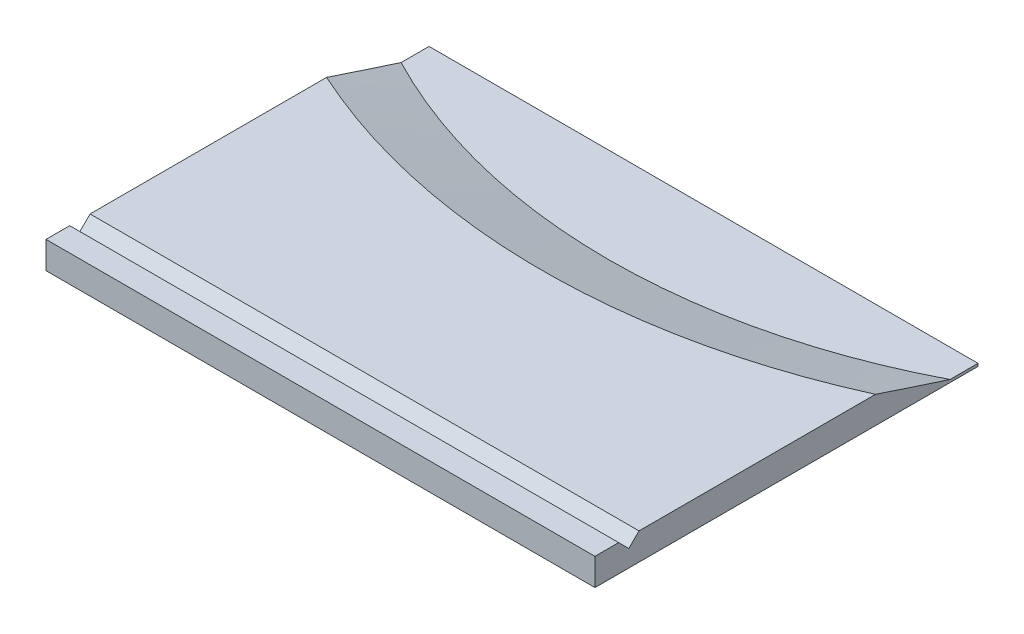
ISO-10303-21;
HEADER;
FILE_DESCRIPTION(('STEP AP214'),'2;1');
FILE_NAME('part.step','',(''),(''),'','','');
FILE_SCHEMA(('AUTOMOTIVE_DESIGN { 1 0 10303 214 1 1 1 1 }'));
ENDSEC;
DATA;
#1=APPLICATION_CONTEXT('core data for automotive mechanical design processes');
#2=APPLICATION_PROTOCOL_DEFINITION('international standard','automotive_design',2000,#1);
#3=PRODUCT_CONTEXT('',#1,'mechanical');
#4=PRODUCT('Part','Part','',(#3));
#5=PRODUCT_RELATED_PRODUCT_CATEGORY('part','',(#4));
#6=PRODUCT_DEFINITION_FORMATION('','',#4);
#7=PRODUCT_DEFINITION_CONTEXT('part definition',#1,'design');
#8=PRODUCT_DEFINITION('design','',#6,#7);
#9=PRODUCT_DEFINITION_SHAPE('','',#8);
#10=(LENGTH_UNIT() NAMED_UNIT(*) SI_UNIT(.MILLI.,.METRE.));
#11=(NAMED_UNIT(*) PLANE_ANGLE_UNIT() SI_UNIT($,.RADIAN.));
#12=(NAMED_UNIT(*) SI_UNIT($,.STERADIAN.) SOLID_ANGLE_UNIT());
#13=UNCERTAINTY_MEASURE_WITH_UNIT(LENGTH_MEASURE(1.E-05),#10,'distance_accuracy_value','');
#14=(GEOMETRIC_REPRESENTATION_CONTEXT(3) GLOBAL_UNCERTAINTY_ASSIGNED_CONTEXT((#13)) GLOBAL_UNIT_ASSIGNED_CONTEXT((#10,
#11,#12)) REPRESENTATION_CONTEXT('',''));
#15=CARTESIAN_POINT('',(0.,0.,0.));
#16=DIRECTION('',(0.,0.,1.));
#17=DIRECTION('',(1.,0.,0.));
#18=AXIS2_PLACEMENT_3D('',#15,#16,#17);
#19=CARTESIAN_POINT('',(0.,2.,0.));
#20=DIRECTION('',(0.,-1.,0.));
#21=DIRECTION('',(0.,0.,-1.));
#22=AXIS2_PLACEMENT_3D('',#19,#20,#21);
#23=PLANE('',#22);
#24=DIRECTION('',(0.,0.,1.));
#25=VECTOR('',#24,1.);
#26=CARTESIAN_POINT('',(-20.25,2.,-14.13));
#27=LINE('',#26,#25);
#28=CARTESIAN_POINT('',(-20.25,2.,-6.56997877610749));
#29=VERTEX_POINT('',#28);
#30=CARTESIAN_POINT('',(-20.25,2.,10.88));
#31=VERTEX_POINT('',#30);
#32=EDGE_CURVE('E169',#29,#31,#27,.T.);
#33=ORIENTED_EDGE('',*,*,#32,.T.);
#34=DIRECTION('',(1.,0.,0.));
#35=VECTOR('',#34,1.);
#36=CARTESIAN_POINT('',(-20.25,2.,10.88));
#37=LINE('',#36,#35);
#38=CARTESIAN_POINT('',(20.25,2.,10.88));
#39=VERTEX_POINT('',#38);
#40=EDGE_CURVE('E130',#31,#39,#37,.T.);
#41=ORIENTED_EDGE('',*,*,#40,.T.);
#42=DIRECTION('',(0.,0.,-1.));
#43=VECTOR('',#42,1.);
#44=CARTESIAN_POINT('',(20.25,2.,-14.13));
#45=LINE('',#44,#43);
#46=CARTESIAN_POINT('',(20.25,2.,-6.56997877610749));
#47=VERTEX_POINT('',#46);
#48=EDGE_CURVE('E175',#39,#47,#45,.T.);
#49=ORIENTED_EDGE('',*,*,#48,.T.);
#50=CARTESIAN_POINT('',(0.,2.,-51.13));
#51=DIRECTION('',(0.,-1.,0.));
#52=DIRECTION('',(0.,0.,-1.));
#53=AXIS2_PLACEMENT_3D('',#50,#51,#52);
#54=CIRCLE('',#53,48.9454593550183);
#55=EDGE_CURVE('E211',#47,#29,#54,.T.);
#56=ORIENTED_EDGE('',*,*,#55,.T.);
#57=EDGE_LOOP('',(#33,#41,#49,#56));
#58=FACE_BOUND('',#57,.T.);
#59=ADVANCED_FACE('F45',(#58),#23,.F.);
#60=CARTESIAN_POINT('',(20.25,2.,-14.13));
#61=DIRECTION('',(0.,0.,1.));
#62=DIRECTION('',(1.,0.,0.));
#63=AXIS2_PLACEMENT_3D('',#60,#61,#62);
#64=PLANE('',#63);
#65=DIRECTION('',(-1.,0.,0.));
#66=VECTOR('',#65,1.);
#67=CARTESIAN_POINT('',(20.25,0.2,-14.13));
#68=LINE('',#67,#66);
#69=CARTESIAN_POINT('',(20.25,0.2,-14.13));
#70=VERTEX_POINT('',#69);
#71=CARTESIAN_POINT('',(-20.25,0.2,-14.13));
#72=VERTEX_POINT('',#71);
#73=EDGE_CURVE('E208',#70,#72,#68,.T.);
#74=ORIENTED_EDGE('',*,*,#73,.F.);
#75=DIRECTION('',(0.,-1.,0.));
#76=VECTOR('',#75,1.);
#77=CARTESIAN_POINT('',(20.25,2.,-14.13));
#78=LINE('',#77,#76);
#79=CARTESIAN_POINT('',(20.25,0.,-14.13));
#80=VERTEX_POINT('',#79);
#81=EDGE_CURVE('E197',#70,#80,#78,.T.);
#82=ORIENTED_EDGE('',*,*,#81,.T.);
#83=DIRECTION('',(-1.,0.,0.));
#84=VECTOR('',#83,1.);
#85=CARTESIAN_POINT('',(20.25,0.,-14.13));
#86=LINE('',#85,#84);
#87=CARTESIAN_POINT('',(-20.25,0.,-14.13));
#88=VERTEX_POINT('',#87);
#89=EDGE_CURVE('E191',#80,#88,#86,.T.);
#90=ORIENTED_EDGE('',*,*,#89,.T.);
#91=DIRECTION('',(0.,-1.,0.));
#92=VECTOR('',#91,1.);
#93=CARTESIAN_POINT('',(-20.25,2.,-14.13));
#94=LINE('',#93,#92);
#95=EDGE_CURVE('E180',#72,#88,#94,.T.);
#96=ORIENTED_EDGE('',*,*,#95,.F.);
#97=EDGE_LOOP('',(#74,#82,#90,#96));
#98=FACE_BOUND('',#97,.T.);
#99=ADVANCED_FACE('F222',(#98),#64,.F.);
#100=CARTESIAN_POINT('',(-20.25,2.,-14.13));
#101=DIRECTION('',(1.,0.,0.));
#102=DIRECTION('',(0.,0.,-1.));
#103=AXIS2_PLACEMENT_3D('',#100,#101,#102);
#104=PLANE('',#103);
#105=DIRECTION('',(0.,-0.707106781186547,-0.707106781186548));
#106=VECTOR('',#105,1.);
#107=CARTESIAN_POINT('',(-20.25,2.,12.38));
#108=LINE('',#107,#106);
#109=CARTESIAN_POINT('',(-20.25,2.,12.38));
#110=VERTEX_POINT('',#109);
#111=CARTESIAN_POINT('',(-20.25,1.25,11.63));
#112=VERTEX_POINT('',#111);
#113=EDGE_CURVE('E68',#110,#112,#108,.T.);
#114=ORIENTED_EDGE('',*,*,#113,.T.);
#115=DIRECTION('',(0.,0.707106781186547,-0.707106781186548));
#116=VECTOR('',#115,1.);
#117=CARTESIAN_POINT('',(-20.25,1.25,11.63));
#118=LINE('',#117,#116);
#119=EDGE_CURVE('E134',#112,#31,#118,.T.);
#120=ORIENTED_EDGE('',*,*,#119,.T.);
#121=ORIENTED_EDGE('',*,*,#32,.F.);
#122=CARTESIAN_POINT('',(-20.25,2.,-6.56997877610749));
#123=CARTESIAN_POINT('',(-20.25,1.84839227835257,-7.02751527477542));
#124=CARTESIAN_POINT('',(-20.25,1.69714261779571,-7.48517053881371));
#125=CARTESIAN_POINT('',(-20.25,1.39542428685237,-8.40073667362824));
#126=CARTESIAN_POINT('',(-20.25,1.24495561378549,-8.85864754352125));
#127=CARTESIAN_POINT('',(-20.25,0.94486300778386,-9.77474633983645));
#128=CARTESIAN_POINT('',(-20.25,0.795239075275908,-10.2329342663985));
#129=CARTESIAN_POINT('',(-20.25,0.496910845473848,-11.1496111241684));
#130=CARTESIAN_POINT('',(-20.25,0.34820655134074,-11.6081000564049));
#131=CARTESIAN_POINT('',(-20.25,0.199999999999995,-12.0667500071999));
#132=B_SPLINE_CURVE_WITH_KNOTS('',3,(#122,#123,#124,#125,#126,#127,#128,#129,#130,#131),
.UNSPECIFIED.,.F.,.F.,(4,2,2,2,4),(0.,1.44600172316287,2.89199848029221,4.33799596794958,
5.78399842305987),.UNSPECIFIED.);
#133=CARTESIAN_POINT('',(-20.25,0.2,-12.0667500071999));
#134=VERTEX_POINT('',#133);
#135=EDGE_CURVE('E61',#29,#134,#132,.T.);
#136=ORIENTED_EDGE('',*,*,#135,.T.);
#137=DIRECTION('',(0.,0.,1.));
#138=VECTOR('',#137,1.);
#139=CARTESIAN_POINT('',(-20.25,0.2,-14.13));
#140=LINE('',#139,#138);
#141=EDGE_CURVE('E164',#72,#134,#140,.T.);
#142=ORIENTED_EDGE('',*,*,#141,.F.);
#143=ORIENTED_EDGE('',*,*,#95,.T.);
#144=DIRECTION('',(0.,0.,1.));
#145=VECTOR('',#144,1.);
#146=CARTESIAN_POINT('',(-20.25,0.,-14.13));
#147=LINE('',#146,#145);
#148=CARTESIAN_POINT('',(-20.25,0.,14.13));
#149=VERTEX_POINT('',#148);
#150=EDGE_CURVE('E168',#88,#149,#147,.T.);
#151=ORIENTED_EDGE('',*,*,#150,.T.);
#152=DIRECTION('',(0.,-1.,0.));
#153=VECTOR('',#152,1.);
#154=CARTESIAN_POINT('',(-20.25,2.,14.13));
#155=LINE('',#154,#153);
#156=CARTESIAN_POINT('',(-20.25,2.,14.13));
#157=VERTEX_POINT('',#156);
#158=EDGE_CURVE('E204',#157,#149,#155,.T.);
#159=ORIENTED_EDGE('',*,*,#158,.F.);
#160=EDGE_CURVE('E145',#110,#157,#27,.T.);
#161=ORIENTED_EDGE('',*,*,#160,.F.);
#162=EDGE_LOOP('',(#114,#120,#121,#136,#142,#143,#151,#159,#161));
#163=FACE_BOUND('',#162,.T.);
#164=ADVANCED_FACE('F143',(#163),#104,.F.);
#165=CARTESIAN_POINT('',(20.25,2.,14.13));
#166=DIRECTION('',(0.,0.,-1.));
#167=DIRECTION('',(-1.,0.,0.));
#168=AXIS2_PLACEMENT_3D('',#165,#166,#167);
#169=PLANE('',#168);
#170=DIRECTION('',(1.,0.,0.));
#171=VECTOR('',#170,1.);
#172=CARTESIAN_POINT('',(20.25,0.,14.13));
#173=LINE('',#172,#171);
#174=CARTESIAN_POINT('',(20.25,0.,14.13));
#175=VERTEX_POINT('',#174);
#176=EDGE_CURVE('E184',#149,#175,#173,.T.);
#177=ORIENTED_EDGE('',*,*,#176,.T.);
#178=DIRECTION('',(0.,-1.,0.));
#179=VECTOR('',#178,1.);
#180=CARTESIAN_POINT('',(20.25,2.,14.13));
#181=LINE('',#180,#179);
#182=CARTESIAN_POINT('',(20.25,2.,14.13));
#183=VERTEX_POINT('',#182);
#184=EDGE_CURVE('E200',#183,#175,#181,.T.);
#185=ORIENTED_EDGE('',*,*,#184,.F.);
#186=DIRECTION('',(1.,0.,0.));
#187=VECTOR('',#186,1.);
#188=CARTESIAN_POINT('',(20.25,2.,14.13));
#189=LINE('',#188,#187);
#190=EDGE_CURVE('E172',#157,#183,#189,.T.);
#191=ORIENTED_EDGE('',*,*,#190,.F.);
#192=ORIENTED_EDGE('',*,*,#158,.T.);
#193=EDGE_LOOP('',(#177,#185,#191,#192));
#194=FACE_BOUND('',#193,.T.);
#195=ADVANCED_FACE('F221',(#194),#169,.F.);
#196=CARTESIAN_POINT('',(20.25,2.,-14.13));
#197=DIRECTION('',(-1.,0.,0.));
#198=DIRECTION('',(0.,0.,1.));
#199=AXIS2_PLACEMENT_3D('',#196,#197,#198);
#200=PLANE('',#199);
#201=ORIENTED_EDGE('',*,*,#48,.F.);
#202=DIRECTION('',(0.,0.707106781186547,-0.707106781186548));
#203=VECTOR('',#202,1.);
#204=CARTESIAN_POINT('',(20.25,1.25,11.63));
#205=LINE('',#204,#203);
#206=CARTESIAN_POINT('',(20.25,1.25,11.63));
#207=VERTEX_POINT('',#206);
#208=EDGE_CURVE('E147',#207,#39,#205,.T.);
#209=ORIENTED_EDGE('',*,*,#208,.F.);
#210=DIRECTION('',(0.,-0.707106781186547,-0.707106781186548));
#211=VECTOR('',#210,1.);
#212=CARTESIAN_POINT('',(20.25,2.,12.38));
#213=LINE('',#212,#211);
#214=CARTESIAN_POINT('',(20.25,2.,12.38));
#215=VERTEX_POINT('',#214);
#216=EDGE_CURVE('E126',#215,#207,#213,.T.);
#217=ORIENTED_EDGE('',*,*,#216,.F.);
#218=EDGE_CURVE('E176',#183,#215,#45,.T.);
#219=ORIENTED_EDGE('',*,*,#218,.F.);
#220=ORIENTED_EDGE('',*,*,#184,.T.);
#221=DIRECTION('',(0.,0.,-1.));
#222=VECTOR('',#221,1.);
#223=CARTESIAN_POINT('',(20.25,0.,-14.13));
#224=LINE('',#223,#222);
#225=EDGE_CURVE('E187',#175,#80,#224,.T.);
#226=ORIENTED_EDGE('',*,*,#225,.T.);
#227=ORIENTED_EDGE('',*,*,#81,.F.);
#228=DIRECTION('',(0.,0.,-1.));
#229=VECTOR('',#228,1.);
#230=CARTESIAN_POINT('',(20.25,0.2,-14.13));
#231=LINE('',#230,#229);
#232=CARTESIAN_POINT('',(20.25,0.2,-12.0667500071999));
#233=VERTEX_POINT('',#232);
#234=EDGE_CURVE('E161',#233,#70,#231,.T.);
#235=ORIENTED_EDGE('',*,*,#234,.F.);
#236=CARTESIAN_POINT('',(20.25,0.199999999999993,-12.0667500071999));
#237=CARTESIAN_POINT('',(20.25,0.348206551340739,-11.6081000564049));
#238=CARTESIAN_POINT('',(20.25,0.496910845473848,-11.1496111241684));
#239=CARTESIAN_POINT('',(20.25,0.795239075275908,-10.2329342663985));
#240=CARTESIAN_POINT('',(20.25,0.94486300778386,-9.77474633983645));
#241=CARTESIAN_POINT('',(20.25,1.24495561378549,-8.85864754352125));
#242=CARTESIAN_POINT('',(20.25,1.39542428685237,-8.40073667362823));
#243=CARTESIAN_POINT('',(20.25,1.69714261779571,-7.4851705388137));
#244=CARTESIAN_POINT('',(20.25,1.84839227835257,-7.02751527477542));
#245=CARTESIAN_POINT('',(20.25,2.,-6.56997877610749));
#246=B_SPLINE_CURVE_WITH_KNOTS('',3,(#236,#237,#238,#239,#240,#241,#242,#243,#244,#245),
.UNSPECIFIED.,.F.,.F.,(4,2,2,2,4),(0.,1.44600245511028,2.89199994276766,4.337996699897,
5.78399842305987),.UNSPECIFIED.);
#247=EDGE_CURVE('E11',#233,#47,#246,.T.);
#248=ORIENTED_EDGE('',*,*,#247,.T.);
#249=EDGE_LOOP('',(#201,#209,#217,#219,#220,#226,#227,#235,#248));
#250=FACE_BOUND('',#249,.T.);
#251=ADVANCED_FACE('F224',(#250),#200,.F.);
#252=ORIENTED_EDGE('',*,*,#218,.T.);
#253=DIRECTION('',(1.,0.,0.));
#254=VECTOR('',#253,1.);
#255=CARTESIAN_POINT('',(-20.25,2.,12.38));
#256=LINE('',#255,#254);
#257=EDGE_CURVE('E131',#110,#215,#256,.T.);
#258=ORIENTED_EDGE('',*,*,#257,.F.);
#259=ORIENTED_EDGE('',*,*,#160,.T.);
#260=ORIENTED_EDGE('',*,*,#190,.T.);
#261=EDGE_LOOP('',(#252,#258,#259,#260));
#262=FACE_BOUND('',#261,.T.);
#263=ADVANCED_FACE('F229',(#262),#23,.F.);
#264=CARTESIAN_POINT('',(0.,0.,0.));
#265=DIRECTION('',(0.,-1.,0.));
#266=DIRECTION('',(0.,0.,-1.));
#267=AXIS2_PLACEMENT_3D('',#264,#265,#266);
#268=PLANE('',#267);
#269=ORIENTED_EDGE('',*,*,#150,.F.);
#270=ORIENTED_EDGE('',*,*,#89,.F.);
#271=ORIENTED_EDGE('',*,*,#225,.F.);
#272=ORIENTED_EDGE('',*,*,#176,.F.);
#273=EDGE_LOOP('',(#269,#270,#271,#272));
#274=FACE_BOUND('',#273,.T.);
#275=ADVANCED_FACE('F234',(#274),#268,.T.);
#276=CARTESIAN_POINT('',(0.,0.2,-51.13));
#277=DIRECTION('',(0.,1.,0.));
#278=DIRECTION('',(0.,0.,1.));
#279=AXIS2_PLACEMENT_3D('',#276,#277,#278);
#280=PLANE('',#279);
#281=ORIENTED_EDGE('',*,*,#141,.T.);
#282=CARTESIAN_POINT('',(0.,0.2,-51.13));
#283=DIRECTION('',(0.,1.,0.));
#284=DIRECTION('',(0.,0.,1.));
#285=AXIS2_PLACEMENT_3D('',#282,#283,#284);
#286=CIRCLE('',#285,44.);
#287=EDGE_CURVE('E155',#134,#233,#286,.T.);
#288=ORIENTED_EDGE('',*,*,#287,.T.);
#289=ORIENTED_EDGE('',*,*,#234,.T.);
#290=ORIENTED_EDGE('',*,*,#73,.T.);
#291=EDGE_LOOP('',(#281,#288,#289,#290));
#292=FACE_BOUND('',#291,.T.);
#293=ADVANCED_FACE('F237',(#292),#280,.T.);
#294=CARTESIAN_POINT('',(0.,2.,-51.13));
#295=DIRECTION('',(0.,1.,0.));
#296=DIRECTION('',(0.,0.,1.));
#297=AXIS2_PLACEMENT_3D('',#294,#295,#296);
#298=CONICAL_SURFACE('',#297,48.9454593550183,1.22173047639603);
#299=ORIENTED_EDGE('',*,*,#247,.F.);
#300=ORIENTED_EDGE('',*,*,#287,.F.);
#301=ORIENTED_EDGE('',*,*,#135,.F.);
#302=ORIENTED_EDGE('',*,*,#55,.F.);
#303=EDGE_LOOP('',(#299,#300,#301,#302));
#304=FACE_BOUND('',#303,.T.);
#305=ADVANCED_FACE('F48',(#304),#298,.F.);
#306=CARTESIAN_POINT('',(-20.25,1.25,11.63));
#307=DIRECTION('',(0.,-0.707106781186548,-0.707106781186547));
#308=DIRECTION('',(0.,0.707106781186547,-0.707106781186548));
#309=AXIS2_PLACEMENT_3D('',#306,#307,#308);
#310=PLANE('',#309);
#311=ORIENTED_EDGE('',*,*,#208,.T.);
#312=ORIENTED_EDGE('',*,*,#40,.F.);
#313=ORIENTED_EDGE('',*,*,#119,.F.);
#314=DIRECTION('',(1.,0.,0.));
#315=VECTOR('',#314,1.);
#316=CARTESIAN_POINT('',(-20.25,1.25,11.63));
#317=LINE('',#316,#315);
#318=EDGE_CURVE('E122',#112,#207,#317,.T.);
#319=ORIENTED_EDGE('',*,*,#318,.T.);
#320=EDGE_LOOP('',(#311,#312,#313,#319));
#321=FACE_BOUND('',#320,.T.);
#322=ADVANCED_FACE('F135',(#321),#310,.F.);
#323=CARTESIAN_POINT('',(-20.25,2.,12.38));
#324=DIRECTION('',(0.,-0.707106781186548,0.707106781186547));
#325=DIRECTION('',(0.,-0.707106781186547,-0.707106781186548));
#326=AXIS2_PLACEMENT_3D('',#323,#324,#325);
#327=PLANE('',#326);
#328=ORIENTED_EDGE('',*,*,#216,.T.);
#329=ORIENTED_EDGE('',*,*,#318,.F.);
#330=ORIENTED_EDGE('',*,*,#113,.F.);
#331=ORIENTED_EDGE('',*,*,#257,.T.);
#332=EDGE_LOOP('',(#328,#329,#330,#331));
#333=FACE_BOUND('',#332,.T.);
#334=ADVANCED_FACE('F124',(#333),#327,.F.);
#335=CLOSED_SHELL('',(#59,#99,#164,#195,#251,#263,#275,#293,#305,#322,#334));
#336=MANIFOLD_SOLID_BREP('B2',#335);
#337=ADVANCED_BREP_SHAPE_REPRESENTATION('',(#18,#336),#14);
#338=SHAPE_DEFINITION_REPRESENTATION(#9,#337);
ENDSEC;
END-ISO-10303-21;
